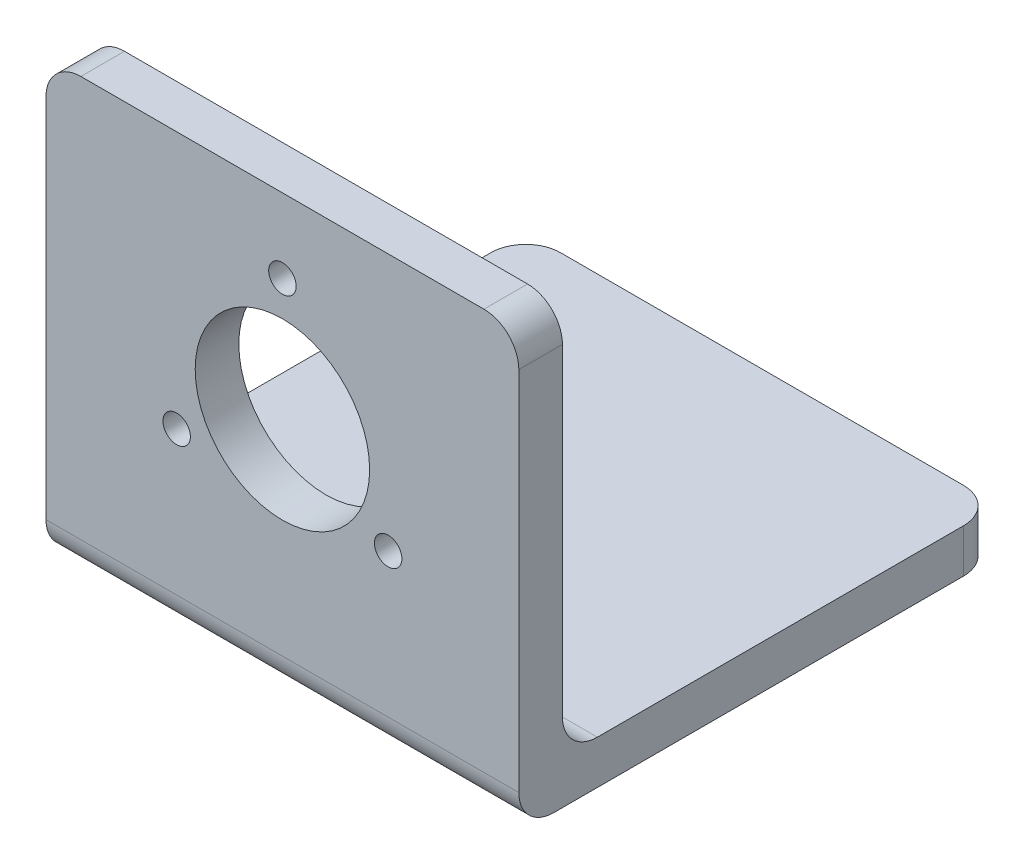
ISO-10303-21;
HEADER;
FILE_DESCRIPTION(('STEP AP214'),'2;1');
FILE_NAME('part.step','',(''),(''),'','','');
FILE_SCHEMA(('AUTOMOTIVE_DESIGN { 1 0 10303 214 1 1 1 1 }'));
ENDSEC;
DATA;
#1=APPLICATION_CONTEXT('core data for automotive mechanical design processes');
#2=APPLICATION_PROTOCOL_DEFINITION('international standard','automotive_design',2000,#1);
#3=PRODUCT_CONTEXT('',#1,'mechanical');
#4=PRODUCT('Part','Part','',(#3));
#5=PRODUCT_RELATED_PRODUCT_CATEGORY('part','',(#4));
#6=PRODUCT_DEFINITION_FORMATION('','',#4);
#7=PRODUCT_DEFINITION_CONTEXT('part definition',#1,'design');
#8=PRODUCT_DEFINITION('design','',#6,#7);
#9=PRODUCT_DEFINITION_SHAPE('','',#8);
#10=(LENGTH_UNIT() NAMED_UNIT(*) SI_UNIT(.MILLI.,.METRE.));
#11=(NAMED_UNIT(*) PLANE_ANGLE_UNIT() SI_UNIT($,.RADIAN.));
#12=(NAMED_UNIT(*) SI_UNIT($,.STERADIAN.) SOLID_ANGLE_UNIT());
#13=UNCERTAINTY_MEASURE_WITH_UNIT(LENGTH_MEASURE(1.E-05),#10,'distance_accuracy_value','');
#14=(GEOMETRIC_REPRESENTATION_CONTEXT(3) GLOBAL_UNCERTAINTY_ASSIGNED_CONTEXT((#13)) GLOBAL_UNIT_ASSIGNED_CONTEXT((#10,
#11,#12)) REPRESENTATION_CONTEXT('',''));
#15=CARTESIAN_POINT('',(0.,0.,0.));
#16=DIRECTION('',(0.,0.,1.));
#17=DIRECTION('',(1.,0.,0.));
#18=AXIS2_PLACEMENT_3D('',#15,#16,#17);
#19=CARTESIAN_POINT('',(0.,0.,5.));
#20=DIRECTION('',(0.,0.,-1.));
#21=DIRECTION('',(-1.,0.,0.));
#22=AXIS2_PLACEMENT_3D('',#19,#20,#21);
#23=PLANE('',#22);
#24=DIRECTION('',(0.,-1.,0.));
#25=VECTOR('',#24,1.);
#26=CARTESIAN_POINT('',(-27.1060382916053,-22.5,5.));
#27=LINE('',#26,#25);
#28=CARTESIAN_POINT('',(-27.1060382916053,18.5,5.));
#29=VERTEX_POINT('',#28);
#30=CARTESIAN_POINT('',(-27.1060382916053,-23.5,5.));
#31=VERTEX_POINT('',#30);
#32=EDGE_CURVE('E216',#29,#31,#27,.T.);
#33=ORIENTED_EDGE('',*,*,#32,.T.);
#34=DIRECTION('',(-1.,0.,0.));
#35=VECTOR('',#34,1.);
#36=CARTESIAN_POINT('',(27.1060382916053,-23.5,5.));
#37=LINE('',#36,#35);
#38=CARTESIAN_POINT('',(27.1060382916053,-23.5,5.));
#39=VERTEX_POINT('',#38);
#40=EDGE_CURVE('E180',#31,#39,#37,.F.);
#41=ORIENTED_EDGE('',*,*,#40,.T.);
#42=DIRECTION('',(0.,1.,0.));
#43=VECTOR('',#42,1.);
#44=CARTESIAN_POINT('',(27.1060382916053,-22.5,5.));
#45=LINE('',#44,#43);
#46=CARTESIAN_POINT('',(27.1060382916053,18.5,5.));
#47=VERTEX_POINT('',#46);
#48=EDGE_CURVE('E219',#39,#47,#45,.T.);
#49=ORIENTED_EDGE('',*,*,#48,.T.);
#50=CARTESIAN_POINT('',(23.1060382916053,18.5,5.));
#51=DIRECTION('',(0.,0.,-1.));
#52=DIRECTION('',(-1.,0.,0.));
#53=AXIS2_PLACEMENT_3D('',#50,#51,#52);
#54=CIRCLE('',#53,4.);
#55=CARTESIAN_POINT('',(23.1060382916053,22.5,5.));
#56=VERTEX_POINT('',#55);
#57=EDGE_CURVE('E61',#47,#56,#54,.F.);
#58=ORIENTED_EDGE('',*,*,#57,.T.);
#59=DIRECTION('',(-1.,0.,0.));
#60=VECTOR('',#59,1.);
#61=CARTESIAN_POINT('',(-27.1060382916053,22.5,5.));
#62=LINE('',#61,#60);
#63=CARTESIAN_POINT('',(-23.1060382916053,22.5,5.));
#64=VERTEX_POINT('',#63);
#65=EDGE_CURVE('E221',#56,#64,#62,.T.);
#66=ORIENTED_EDGE('',*,*,#65,.T.);
#67=CARTESIAN_POINT('',(-23.1060382916053,18.5,5.));
#68=DIRECTION('',(0.,0.,-1.));
#69=DIRECTION('',(-1.,0.,0.));
#70=AXIS2_PLACEMENT_3D('',#67,#68,#69);
#71=CIRCLE('',#70,4.);
#72=EDGE_CURVE('E178',#64,#29,#71,.F.);
#73=ORIENTED_EDGE('',*,*,#72,.T.);
#74=EDGE_LOOP('',(#33,#41,#49,#58,#66,#73));
#75=FACE_BOUND('',#74,.T.);
#76=CARTESIAN_POINT('',(0.,0.,5.));
#77=DIRECTION('',(0.,0.,1.));
#78=DIRECTION('',(1.,0.,0.));
#79=AXIS2_PLACEMENT_3D('',#76,#77,#78);
#80=CIRCLE('',#79,10.);
#81=CARTESIAN_POINT('',(9.99999999999999,0.,5.));
#82=VERTEX_POINT('',#81);
#83=EDGE_CURVE('E209',#82,#82,#80,.T.);
#84=ORIENTED_EDGE('',*,*,#83,.F.);
#85=EDGE_LOOP('',(#84));
#86=FACE_BOUND('',#85,.T.);
#87=CARTESIAN_POINT('',(0.,14.,5.));
#88=DIRECTION('',(0.,0.,1.));
#89=DIRECTION('',(1.,0.,0.));
#90=AXIS2_PLACEMENT_3D('',#87,#88,#89);
#91=CIRCLE('',#90,1.575);
#92=CARTESIAN_POINT('',(1.575,14.,5.));
#93=VERTEX_POINT('',#92);
#94=EDGE_CURVE('E228',#93,#93,#91,.T.);
#95=ORIENTED_EDGE('',*,*,#94,.F.);
#96=EDGE_LOOP('',(#95));
#97=FACE_BOUND('',#96,.T.);
#98=CARTESIAN_POINT('',(12.1243556529827,-6.99999999999965,5.));
#99=DIRECTION('',(0.,0.,1.));
#100=DIRECTION('',(1.,0.,0.));
#101=AXIS2_PLACEMENT_3D('',#98,#99,#100);
#102=CIRCLE('',#101,1.57500000000053);
#103=CARTESIAN_POINT('',(13.6993556529833,-6.99999999999965,5.));
#104=VERTEX_POINT('',#103);
#105=EDGE_CURVE('E233',#104,#104,#102,.T.);
#106=ORIENTED_EDGE('',*,*,#105,.F.);
#107=EDGE_LOOP('',(#106));
#108=FACE_BOUND('',#107,.T.);
#109=CARTESIAN_POINT('',(-12.1243556529815,-7.00000000000034,5.));
#110=DIRECTION('',(0.,0.,1.));
#111=DIRECTION('',(1.,0.,0.));
#112=AXIS2_PLACEMENT_3D('',#109,#110,#111);
#113=CIRCLE('',#112,1.5750000000008);
#114=CARTESIAN_POINT('',(-10.5493556529807,-7.00000000000034,5.));
#115=VERTEX_POINT('',#114);
#116=EDGE_CURVE('E239',#115,#115,#113,.T.);
#117=ORIENTED_EDGE('',*,*,#116,.F.);
#118=EDGE_LOOP('',(#117));
#119=FACE_BOUND('',#118,.T.);
#120=ADVANCED_FACE('F39',(#75,#86,#97,#108,#119),#23,.F.);
#121=CARTESIAN_POINT('',(0.,0.,0.));
#122=DIRECTION('',(0.,0.,-1.));
#123=DIRECTION('',(-1.,0.,0.));
#124=AXIS2_PLACEMENT_3D('',#121,#122,#123);
#125=PLANE('',#124);
#126=CARTESIAN_POINT('',(12.1243556529827,-6.99999999999965,0.));
#127=DIRECTION('',(0.,0.,1.));
#128=DIRECTION('',(1.,0.,0.));
#129=AXIS2_PLACEMENT_3D('',#126,#127,#128);
#130=CIRCLE('',#129,1.57500000000053);
#131=CARTESIAN_POINT('',(13.6993556529833,-6.99999999999965,0.));
#132=VERTEX_POINT('',#131);
#133=EDGE_CURVE('E236',#132,#132,#130,.T.);
#134=ORIENTED_EDGE('',*,*,#133,.T.);
#135=EDGE_LOOP('',(#134));
#136=FACE_BOUND('',#135,.T.);
#137=CARTESIAN_POINT('',(0.,0.,0.));
#138=DIRECTION('',(0.,0.,1.));
#139=DIRECTION('',(1.,0.,0.));
#140=AXIS2_PLACEMENT_3D('',#137,#138,#139);
#141=CIRCLE('',#140,10.);
#142=CARTESIAN_POINT('',(9.99999999999999,0.,0.));
#143=VERTEX_POINT('',#142);
#144=EDGE_CURVE('E213',#143,#143,#141,.T.);
#145=ORIENTED_EDGE('',*,*,#144,.T.);
#146=EDGE_LOOP('',(#145));
#147=FACE_BOUND('',#146,.T.);
#148=DIRECTION('',(0.,1.,0.));
#149=VECTOR('',#148,1.);
#150=CARTESIAN_POINT('',(27.1060382916053,-22.5,0.));
#151=LINE('',#150,#149);
#152=CARTESIAN_POINT('',(27.1060382916053,-18.5,0.));
#153=VERTEX_POINT('',#152);
#154=CARTESIAN_POINT('',(27.1060382916053,18.5,0.));
#155=VERTEX_POINT('',#154);
#156=EDGE_CURVE('E202',#153,#155,#151,.T.);
#157=ORIENTED_EDGE('',*,*,#156,.F.);
#158=DIRECTION('',(1.,0.,0.));
#159=VECTOR('',#158,1.);
#160=CARTESIAN_POINT('',(-27.1060382916053,-18.5,0.));
#161=LINE('',#160,#159);
#162=CARTESIAN_POINT('',(-27.1060382916053,-18.5,0.));
#163=VERTEX_POINT('',#162);
#164=EDGE_CURVE('E162',#153,#163,#161,.F.);
#165=ORIENTED_EDGE('',*,*,#164,.T.);
#166=DIRECTION('',(0.,-1.,0.));
#167=VECTOR('',#166,1.);
#168=CARTESIAN_POINT('',(-27.1060382916053,-22.5,0.));
#169=LINE('',#168,#167);
#170=CARTESIAN_POINT('',(-27.1060382916053,18.5,0.));
#171=VERTEX_POINT('',#170);
#172=EDGE_CURVE('E137',#171,#163,#169,.T.);
#173=ORIENTED_EDGE('',*,*,#172,.F.);
#174=CARTESIAN_POINT('',(-23.1060382916053,18.5,0.));
#175=DIRECTION('',(0.,0.,-1.));
#176=DIRECTION('',(-1.,0.,0.));
#177=AXIS2_PLACEMENT_3D('',#174,#175,#176);
#178=CIRCLE('',#177,4.);
#179=CARTESIAN_POINT('',(-23.1060382916053,22.5,0.));
#180=VERTEX_POINT('',#179);
#181=EDGE_CURVE('E156',#171,#180,#178,.T.);
#182=ORIENTED_EDGE('',*,*,#181,.T.);
#183=DIRECTION('',(-1.,0.,0.));
#184=VECTOR('',#183,1.);
#185=CARTESIAN_POINT('',(-27.1060382916053,22.5,0.));
#186=LINE('',#185,#184);
#187=CARTESIAN_POINT('',(23.1060382916053,22.5,0.));
#188=VERTEX_POINT('',#187);
#189=EDGE_CURVE('E208',#188,#180,#186,.T.);
#190=ORIENTED_EDGE('',*,*,#189,.F.);
#191=CARTESIAN_POINT('',(23.1060382916053,18.5,0.));
#192=DIRECTION('',(0.,0.,-1.));
#193=DIRECTION('',(-1.,0.,0.));
#194=AXIS2_PLACEMENT_3D('',#191,#192,#193);
#195=CIRCLE('',#194,4.);
#196=EDGE_CURVE('E153',#188,#155,#195,.T.);
#197=ORIENTED_EDGE('',*,*,#196,.T.);
#198=EDGE_LOOP('',(#157,#165,#173,#182,#190,#197));
#199=FACE_BOUND('',#198,.T.);
#200=CARTESIAN_POINT('',(0.,14.,0.));
#201=DIRECTION('',(0.,0.,1.));
#202=DIRECTION('',(1.,0.,0.));
#203=AXIS2_PLACEMENT_3D('',#200,#201,#202);
#204=CIRCLE('',#203,1.575);
#205=CARTESIAN_POINT('',(1.575,14.,0.));
#206=VERTEX_POINT('',#205);
#207=EDGE_CURVE('E230',#206,#206,#204,.T.);
#208=ORIENTED_EDGE('',*,*,#207,.T.);
#209=EDGE_LOOP('',(#208));
#210=FACE_BOUND('',#209,.T.);
#211=CARTESIAN_POINT('',(-12.1243556529815,-7.00000000000034,0.));
#212=DIRECTION('',(0.,0.,1.));
#213=DIRECTION('',(1.,0.,0.));
#214=AXIS2_PLACEMENT_3D('',#211,#212,#213);
#215=CIRCLE('',#214,1.5750000000008);
#216=CARTESIAN_POINT('',(-10.5493556529807,-7.00000000000034,0.));
#217=VERTEX_POINT('',#216);
#218=EDGE_CURVE('E242',#217,#217,#215,.T.);
#219=ORIENTED_EDGE('',*,*,#218,.T.);
#220=EDGE_LOOP('',(#219));
#221=FACE_BOUND('',#220,.T.);
#222=ADVANCED_FACE('F205',(#136,#147,#199,#210,#221),#125,.T.);
#223=CARTESIAN_POINT('',(27.1060382916053,-22.5,5.));
#224=DIRECTION('',(-1.,0.,0.));
#225=DIRECTION('',(0.,0.,1.));
#226=AXIS2_PLACEMENT_3D('',#223,#224,#225);
#227=PLANE('',#226);
#228=ORIENTED_EDGE('',*,*,#48,.F.);
#229=CARTESIAN_POINT('',(27.1060382916053,-23.5,1.));
#230=DIRECTION('',(-1.,0.,0.));
#231=DIRECTION('',(0.,0.,1.));
#232=AXIS2_PLACEMENT_3D('',#229,#230,#231);
#233=CIRCLE('',#232,4.);
#234=CARTESIAN_POINT('',(27.1060382916053,-27.5,1.));
#235=VERTEX_POINT('',#234);
#236=EDGE_CURVE('E186',#39,#235,#233,.F.);
#237=ORIENTED_EDGE('',*,*,#236,.T.);
#238=DIRECTION('',(0.,0.,-1.));
#239=VECTOR('',#238,1.);
#240=CARTESIAN_POINT('',(27.1060382916053,-27.5,5.));
#241=LINE('',#240,#239);
#242=CARTESIAN_POINT('',(27.1060382916053,-27.5,-46.));
#243=VERTEX_POINT('',#242);
#244=EDGE_CURVE('E247',#235,#243,#241,.T.);
#245=ORIENTED_EDGE('',*,*,#244,.T.);
#246=DIRECTION('',(0.,-1.,0.));
#247=VECTOR('',#246,1.);
#248=CARTESIAN_POINT('',(27.1060382916053,-22.5,-46.));
#249=LINE('',#248,#247);
#250=CARTESIAN_POINT('',(27.1060382916053,-22.5,-46.));
#251=VERTEX_POINT('',#250);
#252=EDGE_CURVE('E184',#243,#251,#249,.F.);
#253=ORIENTED_EDGE('',*,*,#252,.T.);
#254=DIRECTION('',(0.,0.,-1.));
#255=VECTOR('',#254,1.);
#256=CARTESIAN_POINT('',(27.1060382916053,-22.5,5.));
#257=LINE('',#256,#255);
#258=CARTESIAN_POINT('',(27.1060382916053,-22.5,-4.));
#259=VERTEX_POINT('',#258);
#260=EDGE_CURVE('E149',#259,#251,#257,.T.);
#261=ORIENTED_EDGE('',*,*,#260,.F.);
#262=CARTESIAN_POINT('',(27.1060382916053,-18.5,-4.));
#263=DIRECTION('',(-1.,0.,0.));
#264=DIRECTION('',(0.,0.,1.));
#265=AXIS2_PLACEMENT_3D('',#262,#263,#264);
#266=CIRCLE('',#265,4.);
#267=EDGE_CURVE('E47',#259,#153,#266,.T.);
#268=ORIENTED_EDGE('',*,*,#267,.T.);
#269=ORIENTED_EDGE('',*,*,#156,.T.);
#270=DIRECTION('',(0.,0.,-1.));
#271=VECTOR('',#270,1.);
#272=CARTESIAN_POINT('',(27.1060382916053,18.5,5.));
#273=LINE('',#272,#271);
#274=EDGE_CURVE('E182',#155,#47,#273,.F.);
#275=ORIENTED_EDGE('',*,*,#274,.T.);
#276=EDGE_LOOP('',(#228,#237,#245,#253,#261,#268,#269,#275));
#277=FACE_BOUND('',#276,.T.);
#278=ADVANCED_FACE('F201',(#277),#227,.F.);
#279=CARTESIAN_POINT('',(-27.1060382916053,22.5,5.));
#280=DIRECTION('',(0.,-1.,0.));
#281=DIRECTION('',(0.,0.,-1.));
#282=AXIS2_PLACEMENT_3D('',#279,#280,#281);
#283=PLANE('',#282);
#284=ORIENTED_EDGE('',*,*,#189,.T.);
#285=DIRECTION('',(0.,0.,-1.));
#286=VECTOR('',#285,1.);
#287=CARTESIAN_POINT('',(-23.1060382916053,22.5,5.));
#288=LINE('',#287,#286);
#289=EDGE_CURVE('E54',#180,#64,#288,.F.);
#290=ORIENTED_EDGE('',*,*,#289,.T.);
#291=ORIENTED_EDGE('',*,*,#65,.F.);
#292=DIRECTION('',(0.,0.,-1.));
#293=VECTOR('',#292,1.);
#294=CARTESIAN_POINT('',(23.1060382916053,22.5,5.));
#295=LINE('',#294,#293);
#296=EDGE_CURVE('E194',#56,#188,#295,.T.);
#297=ORIENTED_EDGE('',*,*,#296,.T.);
#298=EDGE_LOOP('',(#284,#290,#291,#297));
#299=FACE_BOUND('',#298,.T.);
#300=ADVANCED_FACE('F276',(#299),#283,.F.);
#301=CARTESIAN_POINT('',(-27.1060382916053,-22.5,5.));
#302=DIRECTION('',(1.,0.,0.));
#303=DIRECTION('',(0.,0.,-1.));
#304=AXIS2_PLACEMENT_3D('',#301,#302,#303);
#305=PLANE('',#304);
#306=DIRECTION('',(0.,0.,-1.));
#307=VECTOR('',#306,1.);
#308=CARTESIAN_POINT('',(-27.1060382916053,-27.5,5.));
#309=LINE('',#308,#307);
#310=CARTESIAN_POINT('',(-27.1060382916053,-27.5,1.));
#311=VERTEX_POINT('',#310);
#312=CARTESIAN_POINT('',(-27.1060382916053,-27.5,-46.));
#313=VERTEX_POINT('',#312);
#314=EDGE_CURVE('E150',#311,#313,#309,.T.);
#315=ORIENTED_EDGE('',*,*,#314,.F.);
#316=CARTESIAN_POINT('',(-27.1060382916053,-23.5,1.));
#317=DIRECTION('',(1.,0.,0.));
#318=DIRECTION('',(0.,0.,-1.));
#319=AXIS2_PLACEMENT_3D('',#316,#317,#318);
#320=CIRCLE('',#319,4.);
#321=EDGE_CURVE('E175',#311,#31,#320,.F.);
#322=ORIENTED_EDGE('',*,*,#321,.T.);
#323=ORIENTED_EDGE('',*,*,#32,.F.);
#324=DIRECTION('',(0.,0.,-1.));
#325=VECTOR('',#324,1.);
#326=CARTESIAN_POINT('',(-27.1060382916053,18.5,5.));
#327=LINE('',#326,#325);
#328=EDGE_CURVE('E171',#29,#171,#327,.T.);
#329=ORIENTED_EDGE('',*,*,#328,.T.);
#330=ORIENTED_EDGE('',*,*,#172,.T.);
#331=CARTESIAN_POINT('',(-27.1060382916053,-18.5,-4.));
#332=DIRECTION('',(1.,0.,0.));
#333=DIRECTION('',(0.,0.,-1.));
#334=AXIS2_PLACEMENT_3D('',#331,#332,#333);
#335=CIRCLE('',#334,4.);
#336=CARTESIAN_POINT('',(-27.1060382916053,-22.5,-4.));
#337=VERTEX_POINT('',#336);
#338=EDGE_CURVE('E11',#163,#337,#335,.T.);
#339=ORIENTED_EDGE('',*,*,#338,.T.);
#340=DIRECTION('',(0.,0.,-1.));
#341=VECTOR('',#340,1.);
#342=CARTESIAN_POINT('',(-27.1060382916053,-22.5,5.));
#343=LINE('',#342,#341);
#344=CARTESIAN_POINT('',(-27.1060382916053,-22.5,-46.));
#345=VERTEX_POINT('',#344);
#346=EDGE_CURVE('E133',#337,#345,#343,.T.);
#347=ORIENTED_EDGE('',*,*,#346,.T.);
#348=DIRECTION('',(0.,1.,0.));
#349=VECTOR('',#348,1.);
#350=CARTESIAN_POINT('',(-27.1060382916053,-27.5,-46.));
#351=LINE('',#350,#349);
#352=EDGE_CURVE('E173',#345,#313,#351,.F.);
#353=ORIENTED_EDGE('',*,*,#352,.T.);
#354=EDGE_LOOP('',(#315,#322,#323,#329,#330,#339,#347,#353));
#355=FACE_BOUND('',#354,.T.);
#356=ADVANCED_FACE('F132',(#355),#305,.F.);
#357=CARTESIAN_POINT('',(0.,0.,5.));
#358=DIRECTION('',(0.,0.,-1.));
#359=DIRECTION('',(-1.,0.,0.));
#360=AXIS2_PLACEMENT_3D('',#357,#358,#359);
#361=CYLINDRICAL_SURFACE('',#360,10.);
#362=ORIENTED_EDGE('',*,*,#83,.T.);
#363=EDGE_LOOP('',(#362));
#364=FACE_BOUND('',#363,.T.);
#365=ORIENTED_EDGE('',*,*,#144,.F.);
#366=EDGE_LOOP('',(#365));
#367=FACE_BOUND('',#366,.T.);
#368=ADVANCED_FACE('F309',(#364,#367),#361,.F.);
#369=CARTESIAN_POINT('',(0.,14.,5.));
#370=DIRECTION('',(0.,0.,-1.));
#371=DIRECTION('',(-1.,0.,0.));
#372=AXIS2_PLACEMENT_3D('',#369,#370,#371);
#373=CYLINDRICAL_SURFACE('',#372,1.575);
#374=ORIENTED_EDGE('',*,*,#94,.T.);
#375=EDGE_LOOP('',(#374));
#376=FACE_BOUND('',#375,.T.);
#377=ORIENTED_EDGE('',*,*,#207,.F.);
#378=EDGE_LOOP('',(#377));
#379=FACE_BOUND('',#378,.T.);
#380=ADVANCED_FACE('F426',(#376,#379),#373,.F.);
#381=CARTESIAN_POINT('',(12.1243556529827,-6.99999999999965,5.));
#382=DIRECTION('',(0.,0.,-1.));
#383=DIRECTION('',(-1.,0.,0.));
#384=AXIS2_PLACEMENT_3D('',#381,#382,#383);
#385=CYLINDRICAL_SURFACE('',#384,1.57500000000053);
#386=ORIENTED_EDGE('',*,*,#105,.T.);
#387=EDGE_LOOP('',(#386));
#388=FACE_BOUND('',#387,.T.);
#389=ORIENTED_EDGE('',*,*,#133,.F.);
#390=EDGE_LOOP('',(#389));
#391=FACE_BOUND('',#390,.T.);
#392=ADVANCED_FACE('F293',(#388,#391),#385,.F.);
#393=CARTESIAN_POINT('',(-12.1243556529815,-7.00000000000034,5.));
#394=DIRECTION('',(0.,0.,-1.));
#395=DIRECTION('',(-1.,0.,0.));
#396=AXIS2_PLACEMENT_3D('',#393,#394,#395);
#397=CYLINDRICAL_SURFACE('',#396,1.5750000000008);
#398=ORIENTED_EDGE('',*,*,#116,.T.);
#399=EDGE_LOOP('',(#398));
#400=FACE_BOUND('',#399,.T.);
#401=ORIENTED_EDGE('',*,*,#218,.F.);
#402=EDGE_LOOP('',(#401));
#403=FACE_BOUND('',#402,.T.);
#404=ADVANCED_FACE('F290',(#400,#403),#397,.F.);
#405=CARTESIAN_POINT('',(27.1060382916053,-22.5,5.));
#406=DIRECTION('',(0.,1.,0.));
#407=DIRECTION('',(0.,0.,1.));
#408=AXIS2_PLACEMENT_3D('',#405,#406,#407);
#409=PLANE('',#408);
#410=ORIENTED_EDGE('',*,*,#346,.F.);
#411=DIRECTION('',(1.,0.,0.));
#412=VECTOR('',#411,1.);
#413=CARTESIAN_POINT('',(27.1060382916053,-22.5,-4.));
#414=LINE('',#413,#412);
#415=EDGE_CURVE('E145',#337,#259,#414,.T.);
#416=ORIENTED_EDGE('',*,*,#415,.T.);
#417=ORIENTED_EDGE('',*,*,#260,.T.);
#418=CARTESIAN_POINT('',(23.1060382916053,-22.5,-46.));
#419=DIRECTION('',(0.,1.,0.));
#420=DIRECTION('',(0.,0.,1.));
#421=AXIS2_PLACEMENT_3D('',#418,#419,#420);
#422=CIRCLE('',#421,4.);
#423=CARTESIAN_POINT('',(23.1060382916053,-22.5,-50.));
#424=VERTEX_POINT('',#423);
#425=EDGE_CURVE('E154',#251,#424,#422,.T.);
#426=ORIENTED_EDGE('',*,*,#425,.T.);
#427=DIRECTION('',(1.,0.,0.));
#428=VECTOR('',#427,1.);
#429=CARTESIAN_POINT('',(27.1060382916053,-22.5,-50.));
#430=LINE('',#429,#428);
#431=CARTESIAN_POINT('',(-23.1060382916053,-22.5,-50.));
#432=VERTEX_POINT('',#431);
#433=EDGE_CURVE('E250',#432,#424,#430,.T.);
#434=ORIENTED_EDGE('',*,*,#433,.F.);
#435=CARTESIAN_POINT('',(-23.1060382916053,-22.5,-46.));
#436=DIRECTION('',(0.,1.,0.));
#437=DIRECTION('',(0.,0.,1.));
#438=AXIS2_PLACEMENT_3D('',#435,#436,#437);
#439=CIRCLE('',#438,4.);
#440=EDGE_CURVE('E148',#432,#345,#439,.T.);
#441=ORIENTED_EDGE('',*,*,#440,.T.);
#442=EDGE_LOOP('',(#410,#416,#417,#426,#434,#441));
#443=FACE_BOUND('',#442,.T.);
#444=ADVANCED_FACE('F143',(#443),#409,.T.);
#445=CARTESIAN_POINT('',(27.1060382916053,-27.5,5.));
#446=DIRECTION('',(0.,-1.,0.));
#447=DIRECTION('',(0.,0.,-1.));
#448=AXIS2_PLACEMENT_3D('',#445,#446,#447);
#449=PLANE('',#448);
#450=ORIENTED_EDGE('',*,*,#244,.F.);
#451=DIRECTION('',(-1.,0.,0.));
#452=VECTOR('',#451,1.);
#453=CARTESIAN_POINT('',(-27.1060382916053,-27.5,1.));
#454=LINE('',#453,#452);
#455=EDGE_CURVE('E168',#235,#311,#454,.T.);
#456=ORIENTED_EDGE('',*,*,#455,.T.);
#457=ORIENTED_EDGE('',*,*,#314,.T.);
#458=CARTESIAN_POINT('',(-23.1060382916053,-27.5,-46.));
#459=DIRECTION('',(0.,-1.,0.));
#460=DIRECTION('',(0.,0.,-1.));
#461=AXIS2_PLACEMENT_3D('',#458,#459,#460);
#462=CIRCLE('',#461,4.);
#463=CARTESIAN_POINT('',(-23.1060382916053,-27.5,-50.));
#464=VERTEX_POINT('',#463);
#465=EDGE_CURVE('E164',#313,#464,#462,.T.);
#466=ORIENTED_EDGE('',*,*,#465,.T.);
#467=DIRECTION('',(-1.,0.,0.));
#468=VECTOR('',#467,1.);
#469=CARTESIAN_POINT('',(27.1060382916053,-27.5,-50.));
#470=LINE('',#469,#468);
#471=CARTESIAN_POINT('',(23.1060382916053,-27.5,-50.));
#472=VERTEX_POINT('',#471);
#473=EDGE_CURVE('E256',#472,#464,#470,.T.);
#474=ORIENTED_EDGE('',*,*,#473,.F.);
#475=CARTESIAN_POINT('',(23.1060382916053,-27.5,-46.));
#476=DIRECTION('',(0.,-1.,0.));
#477=DIRECTION('',(0.,0.,-1.));
#478=AXIS2_PLACEMENT_3D('',#475,#476,#477);
#479=CIRCLE('',#478,4.);
#480=EDGE_CURVE('E166',#472,#243,#479,.T.);
#481=ORIENTED_EDGE('',*,*,#480,.T.);
#482=EDGE_LOOP('',(#450,#456,#457,#466,#474,#481));
#483=FACE_BOUND('',#482,.T.);
#484=ADVANCED_FACE('F268',(#483),#449,.T.);
#485=CARTESIAN_POINT('',(0.,0.,-50.));
#486=DIRECTION('',(0.,0.,-1.));
#487=DIRECTION('',(-1.,0.,0.));
#488=AXIS2_PLACEMENT_3D('',#485,#486,#487);
#489=PLANE('',#488);
#490=ORIENTED_EDGE('',*,*,#433,.T.);
#491=DIRECTION('',(0.,-1.,0.));
#492=VECTOR('',#491,1.);
#493=CARTESIAN_POINT('',(23.1060382916053,-27.5,-50.));
#494=LINE('',#493,#492);
#495=EDGE_CURVE('E191',#424,#472,#494,.T.);
#496=ORIENTED_EDGE('',*,*,#495,.T.);
#497=ORIENTED_EDGE('',*,*,#473,.T.);
#498=DIRECTION('',(0.,1.,0.));
#499=VECTOR('',#498,1.);
#500=CARTESIAN_POINT('',(-23.1060382916053,-22.5,-50.));
#501=LINE('',#500,#499);
#502=EDGE_CURVE('E188',#464,#432,#501,.T.);
#503=ORIENTED_EDGE('',*,*,#502,.T.);
#504=EDGE_LOOP('',(#490,#496,#497,#503));
#505=FACE_BOUND('',#504,.T.);
#506=ADVANCED_FACE('F261',(#505),#489,.T.);
#507=CARTESIAN_POINT('',(27.1060382916053,-18.5,-4.));
#508=DIRECTION('',(-1.,0.,0.));
#509=DIRECTION('',(0.,0.,1.));
#510=AXIS2_PLACEMENT_3D('',#507,#508,#509);
#511=CYLINDRICAL_SURFACE('',#510,4.);
#512=ORIENTED_EDGE('',*,*,#338,.F.);
#513=ORIENTED_EDGE('',*,*,#164,.F.);
#514=ORIENTED_EDGE('',*,*,#267,.F.);
#515=ORIENTED_EDGE('',*,*,#415,.F.);
#516=EDGE_LOOP('',(#512,#513,#514,#515));
#517=FACE_BOUND('',#516,.T.);
#518=ADVANCED_FACE('F152',(#517),#511,.F.);
#519=CARTESIAN_POINT('',(27.1060382916053,-23.5,1.));
#520=DIRECTION('',(1.,0.,0.));
#521=DIRECTION('',(0.,0.,-1.));
#522=AXIS2_PLACEMENT_3D('',#519,#520,#521);
#523=CYLINDRICAL_SURFACE('',#522,4.);
#524=ORIENTED_EDGE('',*,*,#236,.F.);
#525=ORIENTED_EDGE('',*,*,#40,.F.);
#526=ORIENTED_EDGE('',*,*,#321,.F.);
#527=ORIENTED_EDGE('',*,*,#455,.F.);
#528=EDGE_LOOP('',(#524,#525,#526,#527));
#529=FACE_BOUND('',#528,.T.);
#530=ADVANCED_FACE('F272',(#529),#523,.T.);
#531=CARTESIAN_POINT('',(23.1060382916053,0.,-46.));
#532=DIRECTION('',(0.,1.,0.));
#533=DIRECTION('',(0.,0.,1.));
#534=AXIS2_PLACEMENT_3D('',#531,#532,#533);
#535=CYLINDRICAL_SURFACE('',#534,4.);
#536=ORIENTED_EDGE('',*,*,#425,.F.);
#537=ORIENTED_EDGE('',*,*,#252,.F.);
#538=ORIENTED_EDGE('',*,*,#480,.F.);
#539=ORIENTED_EDGE('',*,*,#495,.F.);
#540=EDGE_LOOP('',(#536,#537,#538,#539));
#541=FACE_BOUND('',#540,.T.);
#542=ADVANCED_FACE('F316',(#541),#535,.T.);
#543=CARTESIAN_POINT('',(-23.1060382916053,0.,-46.));
#544=DIRECTION('',(0.,-1.,0.));
#545=DIRECTION('',(0.,0.,-1.));
#546=AXIS2_PLACEMENT_3D('',#543,#544,#545);
#547=CYLINDRICAL_SURFACE('',#546,4.);
#548=ORIENTED_EDGE('',*,*,#465,.F.);
#549=ORIENTED_EDGE('',*,*,#352,.F.);
#550=ORIENTED_EDGE('',*,*,#440,.F.);
#551=ORIENTED_EDGE('',*,*,#502,.F.);
#552=EDGE_LOOP('',(#548,#549,#550,#551));
#553=FACE_BOUND('',#552,.T.);
#554=ADVANCED_FACE('F266',(#553),#547,.T.);
#555=CARTESIAN_POINT('',(-23.1060382916053,18.5,5.));
#556=DIRECTION('',(0.,0.,-1.));
#557=DIRECTION('',(-1.,0.,0.));
#558=AXIS2_PLACEMENT_3D('',#555,#556,#557);
#559=CYLINDRICAL_SURFACE('',#558,4.);
#560=ORIENTED_EDGE('',*,*,#72,.F.);
#561=ORIENTED_EDGE('',*,*,#289,.F.);
#562=ORIENTED_EDGE('',*,*,#181,.F.);
#563=ORIENTED_EDGE('',*,*,#328,.F.);
#564=EDGE_LOOP('',(#560,#561,#562,#563));
#565=FACE_BOUND('',#564,.T.);
#566=ADVANCED_FACE('F275',(#565),#559,.T.);
#567=CARTESIAN_POINT('',(23.1060382916053,18.5,5.));
#568=DIRECTION('',(0.,0.,-1.));
#569=DIRECTION('',(-1.,0.,0.));
#570=AXIS2_PLACEMENT_3D('',#567,#568,#569);
#571=CYLINDRICAL_SURFACE('',#570,4.);
#572=ORIENTED_EDGE('',*,*,#57,.F.);
#573=ORIENTED_EDGE('',*,*,#274,.F.);
#574=ORIENTED_EDGE('',*,*,#196,.F.);
#575=ORIENTED_EDGE('',*,*,#296,.F.);
#576=EDGE_LOOP('',(#572,#573,#574,#575));
#577=FACE_BOUND('',#576,.T.);
#578=ADVANCED_FACE('F41',(#577),#571,.T.);
#579=CLOSED_SHELL('',(#120,#222,#278,#300,#356,#368,#380,#392,#404,#444,#484,#506,#518,#530,
#542,#554,#566,#578));
#580=MANIFOLD_SOLID_BREP('B2',#579);
#581=ADVANCED_BREP_SHAPE_REPRESENTATION('',(#18,#580),#14);
#582=SHAPE_DEFINITION_REPRESENTATION(#9,#581);
ENDSEC;
END-ISO-10303-21;
